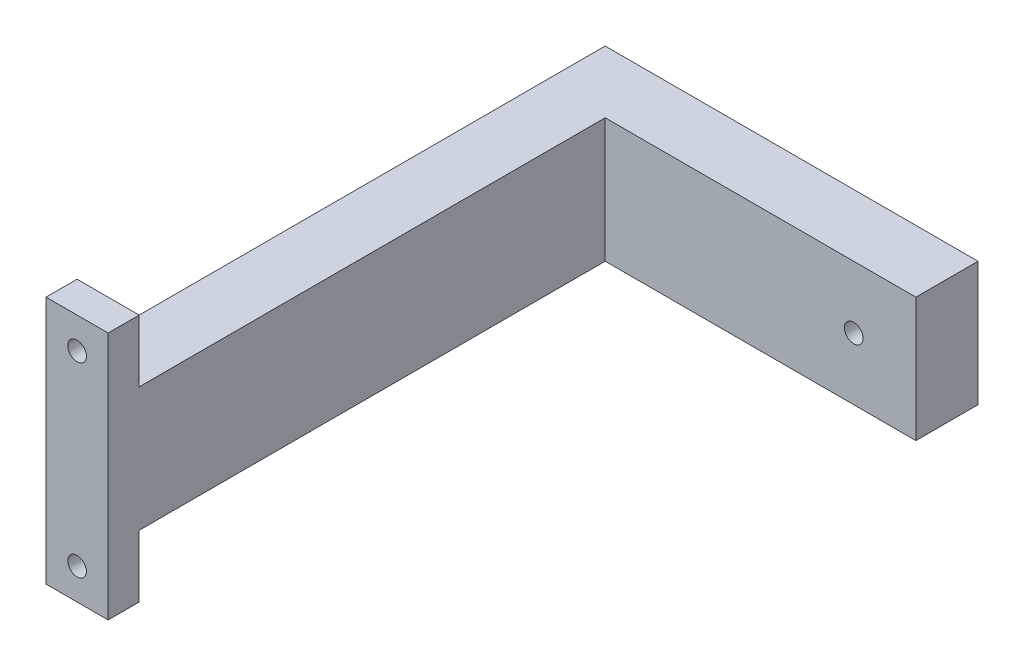
ISO-10303-21;
HEADER;
FILE_DESCRIPTION(('STEP AP214'),'2;1');
FILE_NAME('part.step','',(''),(''),'','','');
FILE_SCHEMA(('AUTOMOTIVE_DESIGN { 1 0 10303 214 1 1 1 1 }'));
ENDSEC;
DATA;
#1=APPLICATION_CONTEXT('core data for automotive mechanical design processes');
#2=APPLICATION_PROTOCOL_DEFINITION('international standard','automotive_design',2000,#1);
#3=PRODUCT_CONTEXT('',#1,'mechanical');
#4=PRODUCT('Part','Part','',(#3));
#5=PRODUCT_RELATED_PRODUCT_CATEGORY('part','',(#4));
#6=PRODUCT_DEFINITION_FORMATION('','',#4);
#7=PRODUCT_DEFINITION_CONTEXT('part definition',#1,'design');
#8=PRODUCT_DEFINITION('design','',#6,#7);
#9=PRODUCT_DEFINITION_SHAPE('','',#8);
#10=(LENGTH_UNIT() NAMED_UNIT(*) SI_UNIT(.MILLI.,.METRE.));
#11=(NAMED_UNIT(*) PLANE_ANGLE_UNIT() SI_UNIT($,.RADIAN.));
#12=(NAMED_UNIT(*) SI_UNIT($,.STERADIAN.) SOLID_ANGLE_UNIT());
#13=UNCERTAINTY_MEASURE_WITH_UNIT(LENGTH_MEASURE(1.E-05),#10,'distance_accuracy_value','');
#14=(GEOMETRIC_REPRESENTATION_CONTEXT(3) GLOBAL_UNCERTAINTY_ASSIGNED_CONTEXT((#13)) GLOBAL_UNIT_ASSIGNED_CONTEXT((#10,
#11,#12)) REPRESENTATION_CONTEXT('',''));
#15=CARTESIAN_POINT('',(0.,0.,0.));
#16=DIRECTION('',(0.,0.,1.));
#17=DIRECTION('',(1.,0.,0.));
#18=AXIS2_PLACEMENT_3D('',#15,#16,#17);
#19=CARTESIAN_POINT('',(0.,20.,0.));
#20=DIRECTION('',(-1.,0.,0.));
#21=DIRECTION('',(0.,0.,1.));
#22=AXIS2_PLACEMENT_3D('',#19,#20,#21);
#23=PLANE('',#22);
#24=DIRECTION('',(0.,0.,-1.));
#25=VECTOR('',#24,1.);
#26=CARTESIAN_POINT('',(0.,20.,0.));
#27=LINE('',#26,#25);
#28=CARTESIAN_POINT('',(0.,20.,-5.));
#29=VERTEX_POINT('',#28);
#30=CARTESIAN_POINT('',(0.,20.,-80.));
#31=VERTEX_POINT('',#30);
#32=EDGE_CURVE('E160',#29,#31,#27,.T.);
#33=ORIENTED_EDGE('',*,*,#32,.F.);
#34=DIRECTION('',(0.,1.,0.));
#35=VECTOR('',#34,1.);
#36=CARTESIAN_POINT('',(0.,-10.,-5.));
#37=LINE('',#36,#35);
#38=CARTESIAN_POINT('',(0.,30.,-5.));
#39=VERTEX_POINT('',#38);
#40=EDGE_CURVE('E151',#29,#39,#37,.T.);
#41=ORIENTED_EDGE('',*,*,#40,.T.);
#42=DIRECTION('',(0.,0.,-1.));
#43=VECTOR('',#42,1.);
#44=CARTESIAN_POINT('',(0.,30.,0.));
#45=LINE('',#44,#43);
#46=CARTESIAN_POINT('',(0.,30.,0.));
#47=VERTEX_POINT('',#46);
#48=EDGE_CURVE('E127',#47,#39,#45,.T.);
#49=ORIENTED_EDGE('',*,*,#48,.F.);
#50=DIRECTION('',(0.,-1.,0.));
#51=VECTOR('',#50,1.);
#52=CARTESIAN_POINT('',(0.,20.,0.));
#53=LINE('',#52,#51);
#54=CARTESIAN_POINT('',(0.,-10.,0.));
#55=VERTEX_POINT('',#54);
#56=EDGE_CURVE('E119',#47,#55,#53,.T.);
#57=ORIENTED_EDGE('',*,*,#56,.T.);
#58=DIRECTION('',(0.,0.,-1.));
#59=VECTOR('',#58,1.);
#60=CARTESIAN_POINT('',(0.,-10.,0.));
#61=LINE('',#60,#59);
#62=CARTESIAN_POINT('',(0.,-10.,-5.));
#63=VERTEX_POINT('',#62);
#64=EDGE_CURVE('E145',#55,#63,#61,.T.);
#65=ORIENTED_EDGE('',*,*,#64,.T.);
#66=CARTESIAN_POINT('',(0.,0.,-5.));
#67=VERTEX_POINT('',#66);
#68=EDGE_CURVE('E155',#63,#67,#37,.T.);
#69=ORIENTED_EDGE('',*,*,#68,.T.);
#70=DIRECTION('',(0.,0.,-1.));
#71=VECTOR('',#70,1.);
#72=CARTESIAN_POINT('',(0.,0.,0.));
#73=LINE('',#72,#71);
#74=CARTESIAN_POINT('',(0.,0.,-80.));
#75=VERTEX_POINT('',#74);
#76=EDGE_CURVE('E159',#67,#75,#73,.T.);
#77=ORIENTED_EDGE('',*,*,#76,.T.);
#78=DIRECTION('',(0.,-1.,0.));
#79=VECTOR('',#78,1.);
#80=CARTESIAN_POINT('',(0.,20.,-80.));
#81=LINE('',#80,#79);
#82=EDGE_CURVE('E40',#31,#75,#81,.T.);
#83=ORIENTED_EDGE('',*,*,#82,.F.);
#84=EDGE_LOOP('',(#33,#41,#49,#57,#65,#69,#77,#83));
#85=FACE_BOUND('',#84,.T.);
#86=ADVANCED_FACE('F33',(#85),#23,.F.);
#87=CARTESIAN_POINT('',(0.,20.,-80.));
#88=DIRECTION('',(0.,0.,-1.));
#89=DIRECTION('',(-1.,0.,0.));
#90=AXIS2_PLACEMENT_3D('',#87,#88,#89);
#91=PLANE('',#90);
#92=CARTESIAN_POINT('',(40.,10.,-80.));
#93=DIRECTION('',(0.,0.,-1.));
#94=DIRECTION('',(-1.,0.,0.));
#95=AXIS2_PLACEMENT_3D('',#92,#93,#94);
#96=CIRCLE('',#95,1.5);
#97=CARTESIAN_POINT('',(38.5,10.,-80.));
#98=VERTEX_POINT('',#97);
#99=EDGE_CURVE('E357',#98,#98,#96,.T.);
#100=ORIENTED_EDGE('',*,*,#99,.T.);
#101=EDGE_LOOP('',(#100));
#102=FACE_BOUND('',#101,.T.);
#103=DIRECTION('',(1.,0.,0.));
#104=VECTOR('',#103,1.);
#105=CARTESIAN_POINT('',(0.,0.,-80.));
#106=LINE('',#105,#104);
#107=CARTESIAN_POINT('',(50.,0.,-80.));
#108=VERTEX_POINT('',#107);
#109=EDGE_CURVE('E171',#75,#108,#106,.T.);
#110=ORIENTED_EDGE('',*,*,#109,.T.);
#111=DIRECTION('',(0.,-1.,0.));
#112=VECTOR('',#111,1.);
#113=CARTESIAN_POINT('',(50.,20.,-80.));
#114=LINE('',#113,#112);
#115=CARTESIAN_POINT('',(50.,20.,-80.));
#116=VERTEX_POINT('',#115);
#117=EDGE_CURVE('E184',#116,#108,#114,.T.);
#118=ORIENTED_EDGE('',*,*,#117,.F.);
#119=DIRECTION('',(1.,0.,0.));
#120=VECTOR('',#119,1.);
#121=CARTESIAN_POINT('',(0.,20.,-80.));
#122=LINE('',#121,#120);
#123=EDGE_CURVE('E162',#31,#116,#122,.T.);
#124=ORIENTED_EDGE('',*,*,#123,.F.);
#125=ORIENTED_EDGE('',*,*,#82,.T.);
#126=EDGE_LOOP('',(#110,#118,#124,#125));
#127=FACE_BOUND('',#126,.T.);
#128=ADVANCED_FACE('F190',(#102,#127),#91,.F.);
#129=CARTESIAN_POINT('',(50.,20.,-80.));
#130=DIRECTION('',(-1.,0.,0.));
#131=DIRECTION('',(0.,0.,1.));
#132=AXIS2_PLACEMENT_3D('',#129,#130,#131);
#133=PLANE('',#132);
#134=DIRECTION('',(0.,0.,-1.));
#135=VECTOR('',#134,1.);
#136=CARTESIAN_POINT('',(50.,0.,-80.));
#137=LINE('',#136,#135);
#138=CARTESIAN_POINT('',(50.,0.,-90.));
#139=VERTEX_POINT('',#138);
#140=EDGE_CURVE('E173',#108,#139,#137,.T.);
#141=ORIENTED_EDGE('',*,*,#140,.T.);
#142=DIRECTION('',(0.,-1.,0.));
#143=VECTOR('',#142,1.);
#144=CARTESIAN_POINT('',(50.,20.,-90.));
#145=LINE('',#144,#143);
#146=CARTESIAN_POINT('',(50.,20.,-90.));
#147=VERTEX_POINT('',#146);
#148=EDGE_CURVE('E181',#147,#139,#145,.T.);
#149=ORIENTED_EDGE('',*,*,#148,.F.);
#150=DIRECTION('',(0.,0.,-1.));
#151=VECTOR('',#150,1.);
#152=CARTESIAN_POINT('',(50.,20.,-80.));
#153=LINE('',#152,#151);
#154=EDGE_CURVE('E165',#116,#147,#153,.T.);
#155=ORIENTED_EDGE('',*,*,#154,.F.);
#156=ORIENTED_EDGE('',*,*,#117,.T.);
#157=EDGE_LOOP('',(#141,#149,#155,#156));
#158=FACE_BOUND('',#157,.T.);
#159=ADVANCED_FACE('F204',(#158),#133,.F.);
#160=CARTESIAN_POINT('',(50.,20.,-90.));
#161=DIRECTION('',(0.,0.,1.));
#162=DIRECTION('',(1.,0.,0.));
#163=AXIS2_PLACEMENT_3D('',#160,#161,#162);
#164=PLANE('',#163);
#165=CARTESIAN_POINT('',(40.,10.,-90.));
#166=DIRECTION('',(0.,0.,-1.));
#167=DIRECTION('',(-1.,0.,0.));
#168=AXIS2_PLACEMENT_3D('',#165,#166,#167);
#169=CIRCLE('',#168,1.5);
#170=CARTESIAN_POINT('',(38.5,10.,-90.));
#171=VERTEX_POINT('',#170);
#172=EDGE_CURVE('E360',#171,#171,#169,.T.);
#173=ORIENTED_EDGE('',*,*,#172,.F.);
#174=EDGE_LOOP('',(#173));
#175=FACE_BOUND('',#174,.T.);
#176=DIRECTION('',(-1.,0.,0.));
#177=VECTOR('',#176,1.);
#178=CARTESIAN_POINT('',(50.,0.,-90.));
#179=LINE('',#178,#177);
#180=CARTESIAN_POINT('',(-10.,0.,-90.));
#181=VERTEX_POINT('',#180);
#182=EDGE_CURVE('E175',#139,#181,#179,.T.);
#183=ORIENTED_EDGE('',*,*,#182,.T.);
#184=DIRECTION('',(0.,-1.,0.));
#185=VECTOR('',#184,1.);
#186=CARTESIAN_POINT('',(-10.,20.,-90.));
#187=LINE('',#186,#185);
#188=CARTESIAN_POINT('',(-10.,20.,-90.));
#189=VERTEX_POINT('',#188);
#190=EDGE_CURVE('E118',#189,#181,#187,.T.);
#191=ORIENTED_EDGE('',*,*,#190,.F.);
#192=DIRECTION('',(-1.,0.,0.));
#193=VECTOR('',#192,1.);
#194=CARTESIAN_POINT('',(50.,20.,-90.));
#195=LINE('',#194,#193);
#196=EDGE_CURVE('E167',#147,#189,#195,.T.);
#197=ORIENTED_EDGE('',*,*,#196,.F.);
#198=ORIENTED_EDGE('',*,*,#148,.T.);
#199=EDGE_LOOP('',(#183,#191,#197,#198));
#200=FACE_BOUND('',#199,.T.);
#201=ADVANCED_FACE('F208',(#175,#200),#164,.F.);
#202=CARTESIAN_POINT('',(-10.,20.,-90.));
#203=DIRECTION('',(1.,0.,0.));
#204=DIRECTION('',(0.,0.,-1.));
#205=AXIS2_PLACEMENT_3D('',#202,#203,#204);
#206=PLANE('',#205);
#207=DIRECTION('',(0.,0.,1.));
#208=VECTOR('',#207,1.);
#209=CARTESIAN_POINT('',(-10.,0.,-90.));
#210=LINE('',#209,#208);
#211=CARTESIAN_POINT('',(-10.,0.,-5.));
#212=VERTEX_POINT('',#211);
#213=EDGE_CURVE('E163',#181,#212,#210,.T.);
#214=ORIENTED_EDGE('',*,*,#213,.T.);
#215=DIRECTION('',(0.,1.,0.));
#216=VECTOR('',#215,1.);
#217=CARTESIAN_POINT('',(-10.,-10.,-5.));
#218=LINE('',#217,#216);
#219=CARTESIAN_POINT('',(-10.,-10.,-5.));
#220=VERTEX_POINT('',#219);
#221=EDGE_CURVE('E152',#220,#212,#218,.T.);
#222=ORIENTED_EDGE('',*,*,#221,.F.);
#223=DIRECTION('',(0.,0.,1.));
#224=VECTOR('',#223,1.);
#225=CARTESIAN_POINT('',(-10.,-10.,0.));
#226=LINE('',#225,#224);
#227=CARTESIAN_POINT('',(-10.,-10.,0.));
#228=VERTEX_POINT('',#227);
#229=EDGE_CURVE('E114',#220,#228,#226,.T.);
#230=ORIENTED_EDGE('',*,*,#229,.T.);
#231=DIRECTION('',(0.,-1.,0.));
#232=VECTOR('',#231,1.);
#233=CARTESIAN_POINT('',(-10.,20.,0.));
#234=LINE('',#233,#232);
#235=CARTESIAN_POINT('',(-10.,30.,0.));
#236=VERTEX_POINT('',#235);
#237=EDGE_CURVE('E106',#236,#228,#234,.T.);
#238=ORIENTED_EDGE('',*,*,#237,.F.);
#239=DIRECTION('',(0.,0.,1.));
#240=VECTOR('',#239,1.);
#241=CARTESIAN_POINT('',(-10.,30.,0.));
#242=LINE('',#241,#240);
#243=CARTESIAN_POINT('',(-10.,30.,-5.));
#244=VERTEX_POINT('',#243);
#245=EDGE_CURVE('E112',#244,#236,#242,.T.);
#246=ORIENTED_EDGE('',*,*,#245,.F.);
#247=CARTESIAN_POINT('',(-10.,20.,-5.00000000000003));
#248=VERTEX_POINT('',#247);
#249=EDGE_CURVE('E154',#248,#244,#218,.T.);
#250=ORIENTED_EDGE('',*,*,#249,.F.);
#251=DIRECTION('',(0.,0.,1.));
#252=VECTOR('',#251,1.);
#253=CARTESIAN_POINT('',(-10.,20.,-90.));
#254=LINE('',#253,#252);
#255=EDGE_CURVE('E47',#189,#248,#254,.T.);
#256=ORIENTED_EDGE('',*,*,#255,.F.);
#257=ORIENTED_EDGE('',*,*,#190,.T.);
#258=EDGE_LOOP('',(#214,#222,#230,#238,#246,#250,#256,#257));
#259=FACE_BOUND('',#258,.T.);
#260=ADVANCED_FACE('F109',(#259),#206,.F.);
#261=CARTESIAN_POINT('',(-10.,20.,0.));
#262=DIRECTION('',(0.,0.,-1.));
#263=DIRECTION('',(-1.,0.,0.));
#264=AXIS2_PLACEMENT_3D('',#261,#262,#263);
#265=PLANE('',#264);
#266=CARTESIAN_POINT('',(-5.,-5.,0.));
#267=DIRECTION('',(0.,0.,-1.));
#268=DIRECTION('',(-1.,0.,0.));
#269=AXIS2_PLACEMENT_3D('',#266,#267,#268);
#270=CIRCLE('',#269,1.5);
#271=CARTESIAN_POINT('',(-6.5,-5.,0.));
#272=VERTEX_POINT('',#271);
#273=EDGE_CURVE('E367',#272,#272,#270,.T.);
#274=ORIENTED_EDGE('',*,*,#273,.T.);
#275=EDGE_LOOP('',(#274));
#276=FACE_BOUND('',#275,.T.);
#277=CARTESIAN_POINT('',(-5.,25.,0.));
#278=DIRECTION('',(0.,0.,-1.));
#279=DIRECTION('',(-1.,0.,0.));
#280=AXIS2_PLACEMENT_3D('',#277,#278,#279);
#281=CIRCLE('',#280,1.5);
#282=CARTESIAN_POINT('',(-6.5,25.,0.));
#283=VERTEX_POINT('',#282);
#284=EDGE_CURVE('E133',#283,#283,#281,.T.);
#285=ORIENTED_EDGE('',*,*,#284,.T.);
#286=EDGE_LOOP('',(#285));
#287=FACE_BOUND('',#286,.T.);
#288=ORIENTED_EDGE('',*,*,#237,.T.);
#289=DIRECTION('',(1.,0.,0.));
#290=VECTOR('',#289,1.);
#291=CARTESIAN_POINT('',(-10.,-10.,0.));
#292=LINE('',#291,#290);
#293=EDGE_CURVE('E143',#228,#55,#292,.T.);
#294=ORIENTED_EDGE('',*,*,#293,.T.);
#295=ORIENTED_EDGE('',*,*,#56,.F.);
#296=DIRECTION('',(1.,0.,0.));
#297=VECTOR('',#296,1.);
#298=CARTESIAN_POINT('',(-10.,30.,0.));
#299=LINE('',#298,#297);
#300=EDGE_CURVE('E122',#236,#47,#299,.T.);
#301=ORIENTED_EDGE('',*,*,#300,.F.);
#302=EDGE_LOOP('',(#288,#294,#295,#301));
#303=FACE_BOUND('',#302,.T.);
#304=ADVANCED_FACE('F123',(#276,#287,#303),#265,.F.);
#305=CARTESIAN_POINT('',(0.,20.,0.));
#306=DIRECTION('',(0.,-1.,0.));
#307=DIRECTION('',(0.,0.,-1.));
#308=AXIS2_PLACEMENT_3D('',#305,#306,#307);
#309=PLANE('',#308);
#310=ORIENTED_EDGE('',*,*,#255,.T.);
#311=DIRECTION('',(1.,0.,0.));
#312=VECTOR('',#311,1.);
#313=CARTESIAN_POINT('',(0.,20.,-5.));
#314=LINE('',#313,#312);
#315=EDGE_CURVE('E51',#248,#29,#314,.T.);
#316=ORIENTED_EDGE('',*,*,#315,.T.);
#317=ORIENTED_EDGE('',*,*,#32,.T.);
#318=ORIENTED_EDGE('',*,*,#123,.T.);
#319=ORIENTED_EDGE('',*,*,#154,.T.);
#320=ORIENTED_EDGE('',*,*,#196,.T.);
#321=EDGE_LOOP('',(#310,#316,#317,#318,#319,#320));
#322=FACE_BOUND('',#321,.T.);
#323=ADVANCED_FACE('F210',(#322),#309,.F.);
#324=CARTESIAN_POINT('',(0.,0.,0.));
#325=DIRECTION('',(0.,-1.,0.));
#326=DIRECTION('',(0.,0.,-1.));
#327=AXIS2_PLACEMENT_3D('',#324,#325,#326);
#328=PLANE('',#327);
#329=DIRECTION('',(1.,0.,0.));
#330=VECTOR('',#329,1.);
#331=CARTESIAN_POINT('',(0.,0.,-5.));
#332=LINE('',#331,#330);
#333=EDGE_CURVE('E11',#212,#67,#332,.T.);
#334=ORIENTED_EDGE('',*,*,#333,.F.);
#335=ORIENTED_EDGE('',*,*,#213,.F.);
#336=ORIENTED_EDGE('',*,*,#182,.F.);
#337=ORIENTED_EDGE('',*,*,#140,.F.);
#338=ORIENTED_EDGE('',*,*,#109,.F.);
#339=ORIENTED_EDGE('',*,*,#76,.F.);
#340=EDGE_LOOP('',(#334,#335,#336,#337,#338,#339));
#341=FACE_BOUND('',#340,.T.);
#342=ADVANCED_FACE('F199',(#341),#328,.T.);
#343=CARTESIAN_POINT('',(0.,-10.,0.));
#344=DIRECTION('',(0.,-1.,0.));
#345=DIRECTION('',(0.,0.,-1.));
#346=AXIS2_PLACEMENT_3D('',#343,#344,#345);
#347=PLANE('',#346);
#348=ORIENTED_EDGE('',*,*,#229,.F.);
#349=DIRECTION('',(-1.,0.,0.));
#350=VECTOR('',#349,1.);
#351=CARTESIAN_POINT('',(-10.,-10.,-5.));
#352=LINE('',#351,#350);
#353=EDGE_CURVE('E148',#63,#220,#352,.T.);
#354=ORIENTED_EDGE('',*,*,#353,.F.);
#355=ORIENTED_EDGE('',*,*,#64,.F.);
#356=ORIENTED_EDGE('',*,*,#293,.F.);
#357=EDGE_LOOP('',(#348,#354,#355,#356));
#358=FACE_BOUND('',#357,.T.);
#359=ADVANCED_FACE('F217',(#358),#347,.T.);
#360=CARTESIAN_POINT('',(-10.,-10.,-5.));
#361=DIRECTION('',(0.,0.,-1.));
#362=DIRECTION('',(-1.,0.,0.));
#363=AXIS2_PLACEMENT_3D('',#360,#361,#362);
#364=PLANE('',#363);
#365=CARTESIAN_POINT('',(-5.,-5.,-5.));
#366=DIRECTION('',(0.,0.,-1.));
#367=DIRECTION('',(-1.,0.,0.));
#368=AXIS2_PLACEMENT_3D('',#365,#366,#367);
#369=CIRCLE('',#368,1.5);
#370=CARTESIAN_POINT('',(-6.5,-5.,-5.));
#371=VERTEX_POINT('',#370);
#372=EDGE_CURVE('E362',#371,#371,#369,.T.);
#373=ORIENTED_EDGE('',*,*,#372,.F.);
#374=EDGE_LOOP('',(#373));
#375=FACE_BOUND('',#374,.T.);
#376=ORIENTED_EDGE('',*,*,#221,.T.);
#377=ORIENTED_EDGE('',*,*,#333,.T.);
#378=ORIENTED_EDGE('',*,*,#68,.F.);
#379=ORIENTED_EDGE('',*,*,#353,.T.);
#380=EDGE_LOOP('',(#376,#377,#378,#379));
#381=FACE_BOUND('',#380,.T.);
#382=ADVANCED_FACE('F257',(#375,#381),#364,.T.);
#383=CARTESIAN_POINT('',(-5.,25.,-5.));
#384=DIRECTION('',(0.,0.,-1.));
#385=DIRECTION('',(-1.,0.,0.));
#386=AXIS2_PLACEMENT_3D('',#383,#384,#385);
#387=CIRCLE('',#386,1.5);
#388=CARTESIAN_POINT('',(-6.5,25.,-5.));
#389=VERTEX_POINT('',#388);
#390=EDGE_CURVE('E136',#389,#389,#387,.T.);
#391=ORIENTED_EDGE('',*,*,#390,.F.);
#392=EDGE_LOOP('',(#391));
#393=FACE_BOUND('',#392,.T.);
#394=ORIENTED_EDGE('',*,*,#315,.F.);
#395=ORIENTED_EDGE('',*,*,#249,.T.);
#396=DIRECTION('',(-1.,0.,0.));
#397=VECTOR('',#396,1.);
#398=CARTESIAN_POINT('',(-10.,30.,-5.));
#399=LINE('',#398,#397);
#400=EDGE_CURVE('E132',#39,#244,#399,.T.);
#401=ORIENTED_EDGE('',*,*,#400,.F.);
#402=ORIENTED_EDGE('',*,*,#40,.F.);
#403=EDGE_LOOP('',(#394,#395,#401,#402));
#404=FACE_BOUND('',#403,.T.);
#405=ADVANCED_FACE('F262',(#393,#404),#364,.T.);
#406=CARTESIAN_POINT('',(0.,30.,0.));
#407=DIRECTION('',(0.,-1.,0.));
#408=DIRECTION('',(0.,0.,-1.));
#409=AXIS2_PLACEMENT_3D('',#406,#407,#408);
#410=PLANE('',#409);
#411=ORIENTED_EDGE('',*,*,#245,.T.);
#412=ORIENTED_EDGE('',*,*,#300,.T.);
#413=ORIENTED_EDGE('',*,*,#48,.T.);
#414=ORIENTED_EDGE('',*,*,#400,.T.);
#415=EDGE_LOOP('',(#411,#412,#413,#414));
#416=FACE_BOUND('',#415,.T.);
#417=ADVANCED_FACE('F130',(#416),#410,.F.);
#418=CARTESIAN_POINT('',(-5.,25.,5.));
#419=DIRECTION('',(0.,0.,-1.));
#420=DIRECTION('',(-1.,0.,0.));
#421=AXIS2_PLACEMENT_3D('',#418,#419,#420);
#422=CYLINDRICAL_SURFACE('',#421,1.5);
#423=ORIENTED_EDGE('',*,*,#390,.T.);
#424=EDGE_LOOP('',(#423));
#425=FACE_BOUND('',#424,.T.);
#426=ORIENTED_EDGE('',*,*,#284,.F.);
#427=EDGE_LOOP('',(#426));
#428=FACE_BOUND('',#427,.T.);
#429=ADVANCED_FACE('F276',(#425,#428),#422,.F.);
#430=CARTESIAN_POINT('',(-5.,-5.,5.));
#431=DIRECTION('',(0.,0.,-1.));
#432=DIRECTION('',(-1.,0.,0.));
#433=AXIS2_PLACEMENT_3D('',#430,#431,#432);
#434=CYLINDRICAL_SURFACE('',#433,1.5);
#435=ORIENTED_EDGE('',*,*,#372,.T.);
#436=EDGE_LOOP('',(#435));
#437=FACE_BOUND('',#436,.T.);
#438=ORIENTED_EDGE('',*,*,#273,.F.);
#439=EDGE_LOOP('',(#438));
#440=FACE_BOUND('',#439,.T.);
#441=ADVANCED_FACE('F281',(#437,#440),#434,.F.);
#442=CARTESIAN_POINT('',(40.,10.,-80.));
#443=DIRECTION('',(0.,0.,-1.));
#444=DIRECTION('',(-1.,0.,0.));
#445=AXIS2_PLACEMENT_3D('',#442,#443,#444);
#446=CYLINDRICAL_SURFACE('',#445,1.5);
#447=ORIENTED_EDGE('',*,*,#99,.F.);
#448=EDGE_LOOP('',(#447));
#449=FACE_BOUND('',#448,.T.);
#450=ORIENTED_EDGE('',*,*,#172,.T.);
#451=EDGE_LOOP('',(#450));
#452=FACE_BOUND('',#451,.T.);
#453=ADVANCED_FACE('F290',(#449,#452),#446,.F.);
#454=CLOSED_SHELL('',(#86,#128,#159,#201,#260,#304,#323,#342,#359,#382,#405,#417,#429,#441,#453));
#455=MANIFOLD_SOLID_BREP('B2',#454);
#456=ADVANCED_BREP_SHAPE_REPRESENTATION('',(#18,#455),#14);
#457=SHAPE_DEFINITION_REPRESENTATION(#9,#456);
ENDSEC;
END-ISO-10303-21;
